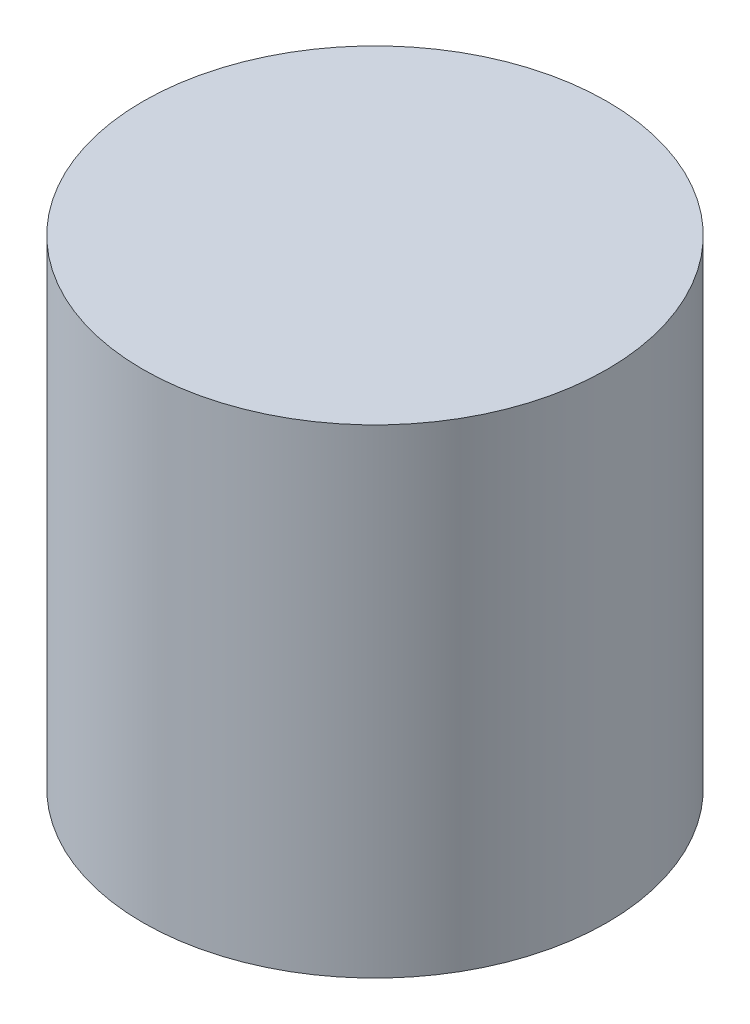
ISO-10303-21;
HEADER;
FILE_DESCRIPTION(('STEP AP214'),'2;1');
FILE_NAME('part.step','',(''),(''),'','','');
FILE_SCHEMA(('AUTOMOTIVE_DESIGN { 1 0 10303 214 1 1 1 1 }'));
ENDSEC;
DATA;
#1=APPLICATION_CONTEXT('core data for automotive mechanical design processes');
#2=APPLICATION_PROTOCOL_DEFINITION('international standard','automotive_design',2000,#1);
#3=PRODUCT_CONTEXT('',#1,'mechanical');
#4=PRODUCT('Part','Part','',(#3));
#5=PRODUCT_RELATED_PRODUCT_CATEGORY('part','',(#4));
#6=PRODUCT_DEFINITION_FORMATION('','',#4);
#7=PRODUCT_DEFINITION_CONTEXT('part definition',#1,'design');
#8=PRODUCT_DEFINITION('design','',#6,#7);
#9=PRODUCT_DEFINITION_SHAPE('','',#8);
#10=(LENGTH_UNIT() NAMED_UNIT(*) SI_UNIT(.MILLI.,.METRE.));
#11=(NAMED_UNIT(*) PLANE_ANGLE_UNIT() SI_UNIT($,.RADIAN.));
#12=(NAMED_UNIT(*) SI_UNIT($,.STERADIAN.) SOLID_ANGLE_UNIT());
#13=UNCERTAINTY_MEASURE_WITH_UNIT(LENGTH_MEASURE(1.E-05),#10,'distance_accuracy_value','');
#14=(GEOMETRIC_REPRESENTATION_CONTEXT(3) GLOBAL_UNCERTAINTY_ASSIGNED_CONTEXT((#13)) GLOBAL_UNIT_ASSIGNED_CONTEXT((#10,
#11,#12)) REPRESENTATION_CONTEXT('',''));
#15=CARTESIAN_POINT('',(0.,0.,0.));
#16=DIRECTION('',(0.,0.,1.));
#17=DIRECTION('',(1.,0.,0.));
#18=AXIS2_PLACEMENT_3D('',#15,#16,#17);
#19=CARTESIAN_POINT('',(0.,-20.64,0.));
#20=DIRECTION('',(0.,1.,0.));
#21=DIRECTION('',(0.,0.,1.));
#22=AXIS2_PLACEMENT_3D('',#19,#20,#21);
#23=CYLINDRICAL_SURFACE('',#22,10.);
#24=CARTESIAN_POINT('',(0.,-20.64,0.));
#25=DIRECTION('',(0.,1.,0.));
#26=DIRECTION('',(0.,0.,1.));
#27=AXIS2_PLACEMENT_3D('',#24,#25,#26);
#28=CIRCLE('',#27,10.);
#29=CARTESIAN_POINT('',(0.,-20.64,10.));
#30=VERTEX_POINT('',#29);
#31=EDGE_CURVE('E10',#30,#30,#28,.T.);
#32=ORIENTED_EDGE('',*,*,#31,.T.);
#33=EDGE_LOOP('',(#32));
#34=FACE_BOUND('',#33,.T.);
#35=CARTESIAN_POINT('',(0.,0.,0.));
#36=DIRECTION('',(0.,1.,0.));
#37=DIRECTION('',(0.,0.,1.));
#38=AXIS2_PLACEMENT_3D('',#35,#36,#37);
#39=CIRCLE('',#38,10.);
#40=CARTESIAN_POINT('',(0.,0.,10.));
#41=VERTEX_POINT('',#40);
#42=EDGE_CURVE('E31',#41,#41,#39,.T.);
#43=ORIENTED_EDGE('',*,*,#42,.F.);
#44=EDGE_LOOP('',(#43));
#45=FACE_BOUND('',#44,.T.);
#46=ADVANCED_FACE('F28',(#34,#45),#23,.T.);
#47=CARTESIAN_POINT('',(0.,-20.64,0.));
#48=DIRECTION('',(0.,1.,0.));
#49=DIRECTION('',(0.,0.,1.));
#50=AXIS2_PLACEMENT_3D('',#47,#48,#49);
#51=PLANE('',#50);
#52=ORIENTED_EDGE('',*,*,#31,.F.);
#53=EDGE_LOOP('',(#52));
#54=FACE_BOUND('',#53,.T.);
#55=ADVANCED_FACE('F43',(#54),#51,.F.);
#56=CARTESIAN_POINT('',(0.,0.,0.));
#57=DIRECTION('',(0.,1.,0.));
#58=DIRECTION('',(0.,0.,1.));
#59=AXIS2_PLACEMENT_3D('',#56,#57,#58);
#60=PLANE('',#59);
#61=ORIENTED_EDGE('',*,*,#42,.T.);
#62=EDGE_LOOP('',(#61));
#63=FACE_BOUND('',#62,.T.);
#64=ADVANCED_FACE('F40',(#63),#60,.T.);
#65=CLOSED_SHELL('',(#46,#55,#64));
#66=MANIFOLD_SOLID_BREP('B2',#65);
#67=ADVANCED_BREP_SHAPE_REPRESENTATION('',(#18,#66),#14);
#68=SHAPE_DEFINITION_REPRESENTATION(#9,#67);
ENDSEC;
END-ISO-10303-21;
